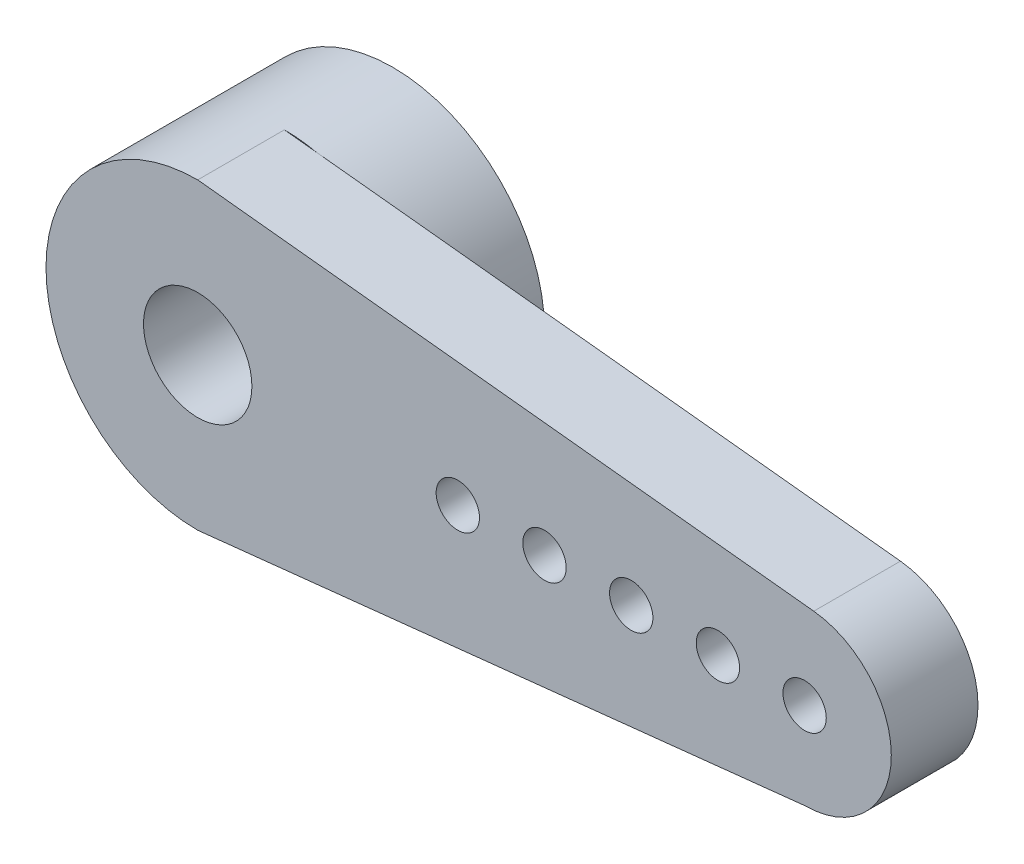
ISO-10303-21;
HEADER;
FILE_DESCRIPTION(('STEP AP214'),'2;1');
FILE_NAME('part.step','',(''),(''),'','','');
FILE_SCHEMA(('AUTOMOTIVE_DESIGN { 1 0 10303 214 1 1 1 1 }'));
ENDSEC;
DATA;
#1=APPLICATION_CONTEXT('core data for automotive mechanical design processes');
#2=APPLICATION_PROTOCOL_DEFINITION('international standard','automotive_design',2000,#1);
#3=PRODUCT_CONTEXT('',#1,'mechanical');
#4=PRODUCT('Part','Part','',(#3));
#5=PRODUCT_RELATED_PRODUCT_CATEGORY('part','',(#4));
#6=PRODUCT_DEFINITION_FORMATION('','',#4);
#7=PRODUCT_DEFINITION_CONTEXT('part definition',#1,'design');
#8=PRODUCT_DEFINITION('design','',#6,#7);
#9=PRODUCT_DEFINITION_SHAPE('','',#8);
#10=(LENGTH_UNIT() NAMED_UNIT(*) SI_UNIT(.MILLI.,.METRE.));
#11=(NAMED_UNIT(*) PLANE_ANGLE_UNIT() SI_UNIT($,.RADIAN.));
#12=(NAMED_UNIT(*) SI_UNIT($,.STERADIAN.) SOLID_ANGLE_UNIT());
#13=UNCERTAINTY_MEASURE_WITH_UNIT(LENGTH_MEASURE(1.E-05),#10,'distance_accuracy_value','');
#14=(GEOMETRIC_REPRESENTATION_CONTEXT(3) GLOBAL_UNCERTAINTY_ASSIGNED_CONTEXT((#13)) GLOBAL_UNIT_ASSIGNED_CONTEXT((#10,
#11,#12)) REPRESENTATION_CONTEXT('',''));
#15=CARTESIAN_POINT('',(0.,0.,0.));
#16=DIRECTION('',(0.,0.,1.));
#17=DIRECTION('',(1.,0.,0.));
#18=AXIS2_PLACEMENT_3D('',#15,#16,#17);
#19=CARTESIAN_POINT('',(0.,0.,0.));
#20=DIRECTION('',(0.,0.,1.));
#21=DIRECTION('',(1.,0.,0.));
#22=AXIS2_PLACEMENT_3D('',#19,#20,#21);
#23=PLANE('',#22);
#24=CARTESIAN_POINT('',(6.,0.,0.));
#25=DIRECTION('',(0.,0.,1.));
#26=DIRECTION('',(1.,0.,0.));
#27=AXIS2_PLACEMENT_3D('',#24,#25,#26);
#28=CIRCLE('',#27,0.500000000000001);
#29=CARTESIAN_POINT('',(6.5,0.,0.));
#30=VERTEX_POINT('',#29);
#31=EDGE_CURVE('E136',#30,#30,#28,.F.);
#32=ORIENTED_EDGE('',*,*,#31,.F.);
#33=EDGE_LOOP('',(#32));
#34=FACE_BOUND('',#33,.T.);
#35=CARTESIAN_POINT('',(8.,0.,0.));
#36=DIRECTION('',(0.,0.,1.));
#37=DIRECTION('',(1.,0.,0.));
#38=AXIS2_PLACEMENT_3D('',#35,#36,#37);
#39=CIRCLE('',#38,0.500000000000001);
#40=CARTESIAN_POINT('',(8.5,0.,0.));
#41=VERTEX_POINT('',#40);
#42=EDGE_CURVE('E142',#41,#41,#39,.F.);
#43=ORIENTED_EDGE('',*,*,#42,.F.);
#44=EDGE_LOOP('',(#43));
#45=FACE_BOUND('',#44,.T.);
#46=CARTESIAN_POINT('',(10.,0.,0.));
#47=DIRECTION('',(0.,0.,1.));
#48=DIRECTION('',(1.,0.,0.));
#49=AXIS2_PLACEMENT_3D('',#46,#47,#48);
#50=CIRCLE('',#49,0.500000000000001);
#51=CARTESIAN_POINT('',(10.5,0.,0.));
#52=VERTEX_POINT('',#51);
#53=EDGE_CURVE('E148',#52,#52,#50,.F.);
#54=ORIENTED_EDGE('',*,*,#53,.F.);
#55=EDGE_LOOP('',(#54));
#56=FACE_BOUND('',#55,.T.);
#57=CARTESIAN_POINT('',(12.,0.,0.));
#58=DIRECTION('',(0.,0.,1.));
#59=DIRECTION('',(1.,0.,0.));
#60=AXIS2_PLACEMENT_3D('',#57,#58,#59);
#61=CIRCLE('',#60,0.500000000000001);
#62=CARTESIAN_POINT('',(12.5,0.,0.));
#63=VERTEX_POINT('',#62);
#64=EDGE_CURVE('E154',#63,#63,#61,.F.);
#65=ORIENTED_EDGE('',*,*,#64,.F.);
#66=EDGE_LOOP('',(#65));
#67=FACE_BOUND('',#66,.T.);
#68=CARTESIAN_POINT('',(14.,0.,0.));
#69=DIRECTION('',(0.,0.,1.));
#70=DIRECTION('',(1.,0.,0.));
#71=AXIS2_PLACEMENT_3D('',#68,#69,#70);
#72=CIRCLE('',#71,0.500000000000001);
#73=CARTESIAN_POINT('',(14.5,0.,0.));
#74=VERTEX_POINT('',#73);
#75=EDGE_CURVE('E161',#74,#74,#72,.T.);
#76=ORIENTED_EDGE('',*,*,#75,.T.);
#77=EDGE_LOOP('',(#76));
#78=FACE_BOUND('',#77,.T.);
#79=CARTESIAN_POINT('',(0.,0.,0.));
#80=DIRECTION('',(0.,0.,-1.));
#81=DIRECTION('',(-1.,0.,0.));
#82=AXIS2_PLACEMENT_3D('',#79,#80,#81);
#83=CIRCLE('',#82,3.5);
#84=CARTESIAN_POINT('',(0.736039193596259,3.42173147770104,0.));
#85=VERTEX_POINT('',#84);
#86=CARTESIAN_POINT('',(0.741488020176546,-3.42055485498108,0.));
#87=VERTEX_POINT('',#86);
#88=EDGE_CURVE('E11',#85,#87,#83,.T.);
#89=ORIENTED_EDGE('',*,*,#88,.F.);
#90=DIRECTION('',(-0.994393675829005,0.105741276100108,0.));
#91=VECTOR('',#90,1.);
#92=CARTESIAN_POINT('',(0.,3.5,0.));
#93=LINE('',#92,#91);
#94=CARTESIAN_POINT('',(14.2114825522002,1.98878735165801,0.));
#95=VERTEX_POINT('',#94);
#96=EDGE_CURVE('E107',#95,#85,#93,.T.);
#97=ORIENTED_EDGE('',*,*,#96,.F.);
#98=CARTESIAN_POINT('',(14.,0.,0.));
#99=DIRECTION('',(0.,0.,1.));
#100=DIRECTION('',(1.,0.,0.));
#101=AXIS2_PLACEMENT_3D('',#98,#99,#100);
#102=CIRCLE('',#101,2.);
#103=CARTESIAN_POINT('',(14.,-2.,0.));
#104=VERTEX_POINT('',#103);
#105=EDGE_CURVE('E74',#104,#95,#102,.T.);
#106=ORIENTED_EDGE('',*,*,#105,.F.);
#107=DIRECTION('',(0.994309153919809,0.106533123634266,0.));
#108=VECTOR('',#107,1.);
#109=CARTESIAN_POINT('',(0.,-3.5,0.));
#110=LINE('',#109,#108);
#111=EDGE_CURVE('E67',#87,#104,#110,.T.);
#112=ORIENTED_EDGE('',*,*,#111,.F.);
#113=EDGE_LOOP('',(#89,#97,#106,#112));
#114=FACE_BOUND('',#113,.T.);
#115=ADVANCED_FACE('F33',(#34,#45,#56,#67,#78,#114),#23,.F.);
#116=CARTESIAN_POINT('',(0.,0.,2.));
#117=DIRECTION('',(0.,0.,1.));
#118=DIRECTION('',(1.,0.,0.));
#119=AXIS2_PLACEMENT_3D('',#116,#117,#118);
#120=PLANE('',#119);
#121=CARTESIAN_POINT('',(6.,0.,2.));
#122=DIRECTION('',(0.,0.,1.));
#123=DIRECTION('',(1.,0.,0.));
#124=AXIS2_PLACEMENT_3D('',#121,#122,#123);
#125=CIRCLE('',#124,0.500000000000001);
#126=CARTESIAN_POINT('',(6.5,0.,2.));
#127=VERTEX_POINT('',#126);
#128=EDGE_CURVE('E133',#127,#127,#125,.T.);
#129=ORIENTED_EDGE('',*,*,#128,.F.);
#130=EDGE_LOOP('',(#129));
#131=FACE_BOUND('',#130,.T.);
#132=CARTESIAN_POINT('',(8.,0.,2.));
#133=DIRECTION('',(0.,0.,1.));
#134=DIRECTION('',(1.,0.,0.));
#135=AXIS2_PLACEMENT_3D('',#132,#133,#134);
#136=CIRCLE('',#135,0.500000000000001);
#137=CARTESIAN_POINT('',(8.5,0.,2.));
#138=VERTEX_POINT('',#137);
#139=EDGE_CURVE('E139',#138,#138,#136,.T.);
#140=ORIENTED_EDGE('',*,*,#139,.F.);
#141=EDGE_LOOP('',(#140));
#142=FACE_BOUND('',#141,.T.);
#143=CARTESIAN_POINT('',(10.,0.,2.));
#144=DIRECTION('',(0.,0.,1.));
#145=DIRECTION('',(1.,0.,0.));
#146=AXIS2_PLACEMENT_3D('',#143,#144,#145);
#147=CIRCLE('',#146,0.500000000000001);
#148=CARTESIAN_POINT('',(10.5,0.,2.));
#149=VERTEX_POINT('',#148);
#150=EDGE_CURVE('E145',#149,#149,#147,.T.);
#151=ORIENTED_EDGE('',*,*,#150,.F.);
#152=EDGE_LOOP('',(#151));
#153=FACE_BOUND('',#152,.T.);
#154=CARTESIAN_POINT('',(12.,0.,2.));
#155=DIRECTION('',(0.,0.,1.));
#156=DIRECTION('',(1.,0.,0.));
#157=AXIS2_PLACEMENT_3D('',#154,#155,#156);
#158=CIRCLE('',#157,0.500000000000001);
#159=CARTESIAN_POINT('',(12.5,0.,2.));
#160=VERTEX_POINT('',#159);
#161=EDGE_CURVE('E151',#160,#160,#158,.T.);
#162=ORIENTED_EDGE('',*,*,#161,.F.);
#163=EDGE_LOOP('',(#162));
#164=FACE_BOUND('',#163,.T.);
#165=CARTESIAN_POINT('',(14.,0.,2.));
#166=DIRECTION('',(0.,0.,1.));
#167=DIRECTION('',(1.,0.,0.));
#168=AXIS2_PLACEMENT_3D('',#165,#166,#167);
#169=CIRCLE('',#168,0.500000000000001);
#170=CARTESIAN_POINT('',(14.5,0.,2.));
#171=VERTEX_POINT('',#170);
#172=EDGE_CURVE('E164',#171,#171,#169,.T.);
#173=ORIENTED_EDGE('',*,*,#172,.F.);
#174=EDGE_LOOP('',(#173));
#175=FACE_BOUND('',#174,.T.);
#176=CARTESIAN_POINT('',(0.,0.,2.));
#177=DIRECTION('',(0.,0.,1.));
#178=DIRECTION('',(1.,0.,0.));
#179=AXIS2_PLACEMENT_3D('',#176,#177,#178);
#180=CIRCLE('',#179,3.5);
#181=CARTESIAN_POINT('',(0.,3.5,2.));
#182=VERTEX_POINT('',#181);
#183=CARTESIAN_POINT('',(0.,-3.5,2.));
#184=VERTEX_POINT('',#183);
#185=EDGE_CURVE('E111',#182,#184,#180,.T.);
#186=ORIENTED_EDGE('',*,*,#185,.T.);
#187=DIRECTION('',(0.994309153919809,0.106533123634266,0.));
#188=VECTOR('',#187,1.);
#189=CARTESIAN_POINT('',(0.,-3.5,2.));
#190=LINE('',#189,#188);
#191=CARTESIAN_POINT('',(14.,-2.,2.));
#192=VERTEX_POINT('',#191);
#193=EDGE_CURVE('E80',#184,#192,#190,.T.);
#194=ORIENTED_EDGE('',*,*,#193,.T.);
#195=CARTESIAN_POINT('',(14.,0.,2.));
#196=DIRECTION('',(0.,0.,1.));
#197=DIRECTION('',(1.,0.,0.));
#198=AXIS2_PLACEMENT_3D('',#195,#196,#197);
#199=CIRCLE('',#198,2.);
#200=CARTESIAN_POINT('',(14.2114825522002,1.98878735165801,2.));
#201=VERTEX_POINT('',#200);
#202=EDGE_CURVE('E115',#192,#201,#199,.T.);
#203=ORIENTED_EDGE('',*,*,#202,.T.);
#204=DIRECTION('',(-0.994393675829005,0.105741276100108,0.));
#205=VECTOR('',#204,1.);
#206=CARTESIAN_POINT('',(0.,3.5,2.));
#207=LINE('',#206,#205);
#208=EDGE_CURVE('E52',#201,#182,#207,.T.);
#209=ORIENTED_EDGE('',*,*,#208,.T.);
#210=EDGE_LOOP('',(#186,#194,#203,#209));
#211=FACE_BOUND('',#210,.T.);
#212=CARTESIAN_POINT('',(0.,0.,2.));
#213=DIRECTION('',(0.,0.,1.));
#214=DIRECTION('',(1.,0.,0.));
#215=AXIS2_PLACEMENT_3D('',#212,#213,#214);
#216=CIRCLE('',#215,1.25);
#217=CARTESIAN_POINT('',(1.25,0.,2.));
#218=VERTEX_POINT('',#217);
#219=EDGE_CURVE('E158',#218,#218,#216,.T.);
#220=ORIENTED_EDGE('',*,*,#219,.F.);
#221=EDGE_LOOP('',(#220));
#222=FACE_BOUND('',#221,.T.);
#223=ADVANCED_FACE('F178',(#131,#142,#153,#164,#175,#211,#222),#120,.T.);
#224=CARTESIAN_POINT('',(0.,0.,0.));
#225=DIRECTION('',(0.,0.,-1.));
#226=DIRECTION('',(-1.,0.,0.));
#227=AXIS2_PLACEMENT_3D('',#224,#225,#226);
#228=CIRCLE('',#227,2.5);
#229=CARTESIAN_POINT('',(-2.5,0.,0.));
#230=VERTEX_POINT('',#229);
#231=EDGE_CURVE('E200',#230,#230,#228,.T.);
#232=ORIENTED_EDGE('',*,*,#231,.T.);
#233=EDGE_LOOP('',(#232));
#234=FACE_BOUND('',#233,.T.);
#235=CARTESIAN_POINT('',(0.,0.,0.));
#236=DIRECTION('',(0.,0.,1.));
#237=DIRECTION('',(1.,0.,0.));
#238=AXIS2_PLACEMENT_3D('',#235,#236,#237);
#239=CIRCLE('',#238,1.25);
#240=CARTESIAN_POINT('',(1.25,0.,0.));
#241=VERTEX_POINT('',#240);
#242=EDGE_CURVE('E157',#241,#241,#239,.T.);
#243=ORIENTED_EDGE('',*,*,#242,.T.);
#244=EDGE_LOOP('',(#243));
#245=FACE_BOUND('',#244,.T.);
#246=ADVANCED_FACE('F181',(#234,#245),#23,.F.);
#247=CARTESIAN_POINT('',(0.,0.,2.));
#248=DIRECTION('',(0.,0.,-1.));
#249=DIRECTION('',(-1.,0.,0.));
#250=AXIS2_PLACEMENT_3D('',#247,#248,#249);
#251=CYLINDRICAL_SURFACE('',#250,3.5);
#252=DIRECTION('',(0.,0.,-1.));
#253=VECTOR('',#252,1.);
#254=CARTESIAN_POINT('',(0.,3.5,2.));
#255=LINE('',#254,#253);
#256=CARTESIAN_POINT('',(0.,3.5,0.));
#257=VERTEX_POINT('',#256);
#258=EDGE_CURVE('E104',#182,#257,#255,.T.);
#259=ORIENTED_EDGE('',*,*,#258,.T.);
#260=EDGE_CURVE('E91',#257,#85,#83,.T.);
#261=ORIENTED_EDGE('',*,*,#260,.T.);
#262=ORIENTED_EDGE('',*,*,#88,.T.);
#263=CARTESIAN_POINT('',(0.,-3.5,0.));
#264=VERTEX_POINT('',#263);
#265=EDGE_CURVE('E99',#87,#264,#83,.T.);
#266=ORIENTED_EDGE('',*,*,#265,.T.);
#267=DIRECTION('',(0.,0.,-1.));
#268=VECTOR('',#267,1.);
#269=CARTESIAN_POINT('',(0.,-3.5,2.));
#270=LINE('',#269,#268);
#271=EDGE_CURVE('E43',#184,#264,#270,.T.);
#272=ORIENTED_EDGE('',*,*,#271,.F.);
#273=ORIENTED_EDGE('',*,*,#185,.F.);
#274=EDGE_LOOP('',(#259,#261,#262,#266,#272,#273));
#275=FACE_BOUND('',#274,.T.);
#276=CARTESIAN_POINT('',(0.,0.,-2.5));
#277=DIRECTION('',(0.,0.,-1.));
#278=DIRECTION('',(-1.,0.,0.));
#279=AXIS2_PLACEMENT_3D('',#276,#277,#278);
#280=CIRCLE('',#279,3.5);
#281=CARTESIAN_POINT('',(-3.5,0.,-2.5));
#282=VERTEX_POINT('',#281);
#283=EDGE_CURVE('E98',#282,#282,#280,.T.);
#284=ORIENTED_EDGE('',*,*,#283,.F.);
#285=EDGE_LOOP('',(#284));
#286=FACE_BOUND('',#285,.T.);
#287=ADVANCED_FACE('F35',(#275,#286),#251,.T.);
#288=CARTESIAN_POINT('',(0.,-3.5,2.));
#289=DIRECTION('',(-0.106533123634266,0.994309153919809,0.));
#290=DIRECTION('',(-0.994309153919809,-0.106533123634266,0.));
#291=AXIS2_PLACEMENT_3D('',#288,#289,#290);
#292=PLANE('',#291);
#293=EDGE_CURVE('E127',#264,#87,#110,.T.);
#294=ORIENTED_EDGE('',*,*,#293,.T.);
#295=ORIENTED_EDGE('',*,*,#111,.T.);
#296=DIRECTION('',(0.,0.,-1.));
#297=VECTOR('',#296,1.);
#298=CARTESIAN_POINT('',(14.,-2.,2.));
#299=LINE('',#298,#297);
#300=EDGE_CURVE('E113',#192,#104,#299,.T.);
#301=ORIENTED_EDGE('',*,*,#300,.F.);
#302=ORIENTED_EDGE('',*,*,#193,.F.);
#303=ORIENTED_EDGE('',*,*,#271,.T.);
#304=EDGE_LOOP('',(#294,#295,#301,#302,#303));
#305=FACE_BOUND('',#304,.T.);
#306=ADVANCED_FACE('F173',(#305),#292,.F.);
#307=CARTESIAN_POINT('',(14.,0.,2.));
#308=DIRECTION('',(0.,0.,-1.));
#309=DIRECTION('',(-1.,0.,0.));
#310=AXIS2_PLACEMENT_3D('',#307,#308,#309);
#311=CYLINDRICAL_SURFACE('',#310,2.);
#312=ORIENTED_EDGE('',*,*,#105,.T.);
#313=DIRECTION('',(0.,0.,-1.));
#314=VECTOR('',#313,1.);
#315=CARTESIAN_POINT('',(14.2114825522002,1.98878735165801,2.));
#316=LINE('',#315,#314);
#317=EDGE_CURVE('E112',#201,#95,#316,.T.);
#318=ORIENTED_EDGE('',*,*,#317,.F.);
#319=ORIENTED_EDGE('',*,*,#202,.F.);
#320=ORIENTED_EDGE('',*,*,#300,.T.);
#321=EDGE_LOOP('',(#312,#318,#319,#320));
#322=FACE_BOUND('',#321,.T.);
#323=ADVANCED_FACE('F310',(#322),#311,.T.);
#324=CARTESIAN_POINT('',(0.,3.5,2.));
#325=DIRECTION('',(-0.105741276100108,-0.994393675829005,0.));
#326=DIRECTION('',(0.994393675829005,-0.105741276100108,0.));
#327=AXIS2_PLACEMENT_3D('',#324,#325,#326);
#328=PLANE('',#327);
#329=ORIENTED_EDGE('',*,*,#96,.T.);
#330=EDGE_CURVE('E94',#85,#257,#93,.T.);
#331=ORIENTED_EDGE('',*,*,#330,.T.);
#332=ORIENTED_EDGE('',*,*,#258,.F.);
#333=ORIENTED_EDGE('',*,*,#208,.F.);
#334=ORIENTED_EDGE('',*,*,#317,.T.);
#335=EDGE_LOOP('',(#329,#331,#332,#333,#334));
#336=FACE_BOUND('',#335,.T.);
#337=ADVANCED_FACE('F103',(#336),#328,.F.);
#338=CARTESIAN_POINT('',(14.,0.,2.));
#339=DIRECTION('',(0.,0.,-1.));
#340=DIRECTION('',(-1.,0.,0.));
#341=AXIS2_PLACEMENT_3D('',#338,#339,#340);
#342=CYLINDRICAL_SURFACE('',#341,0.500000000000001);
#343=ORIENTED_EDGE('',*,*,#172,.T.);
#344=EDGE_LOOP('',(#343));
#345=FACE_BOUND('',#344,.T.);
#346=ORIENTED_EDGE('',*,*,#75,.F.);
#347=EDGE_LOOP('',(#346));
#348=FACE_BOUND('',#347,.T.);
#349=ADVANCED_FACE('F206',(#345,#348),#342,.F.);
#350=CARTESIAN_POINT('',(0.,0.,2.));
#351=DIRECTION('',(0.,0.,-1.));
#352=DIRECTION('',(-1.,0.,0.));
#353=AXIS2_PLACEMENT_3D('',#350,#351,#352);
#354=CYLINDRICAL_SURFACE('',#353,1.25);
#355=ORIENTED_EDGE('',*,*,#219,.T.);
#356=EDGE_LOOP('',(#355));
#357=FACE_BOUND('',#356,.T.);
#358=ORIENTED_EDGE('',*,*,#242,.F.);
#359=EDGE_LOOP('',(#358));
#360=FACE_BOUND('',#359,.T.);
#361=ADVANCED_FACE('F203',(#357,#360),#354,.F.);
#362=CARTESIAN_POINT('',(12.,0.,-0.00100000000000013));
#363=DIRECTION('',(0.,0.,1.));
#364=DIRECTION('',(1.,0.,0.));
#365=AXIS2_PLACEMENT_3D('',#362,#363,#364);
#366=CYLINDRICAL_SURFACE('',#365,0.500000000000001);
#367=ORIENTED_EDGE('',*,*,#161,.T.);
#368=EDGE_LOOP('',(#367));
#369=FACE_BOUND('',#368,.T.);
#370=ORIENTED_EDGE('',*,*,#64,.T.);
#371=EDGE_LOOP('',(#370));
#372=FACE_BOUND('',#371,.T.);
#373=ADVANCED_FACE('F205',(#369,#372),#366,.F.);
#374=CARTESIAN_POINT('',(10.,0.,-0.00100000000000013));
#375=DIRECTION('',(0.,0.,1.));
#376=DIRECTION('',(1.,0.,0.));
#377=AXIS2_PLACEMENT_3D('',#374,#375,#376);
#378=CYLINDRICAL_SURFACE('',#377,0.500000000000001);
#379=ORIENTED_EDGE('',*,*,#150,.T.);
#380=EDGE_LOOP('',(#379));
#381=FACE_BOUND('',#380,.T.);
#382=ORIENTED_EDGE('',*,*,#53,.T.);
#383=EDGE_LOOP('',(#382));
#384=FACE_BOUND('',#383,.T.);
#385=ADVANCED_FACE('F213',(#381,#384),#378,.F.);
#386=CARTESIAN_POINT('',(8.,0.,-0.00100000000000013));
#387=DIRECTION('',(0.,0.,1.));
#388=DIRECTION('',(1.,0.,0.));
#389=AXIS2_PLACEMENT_3D('',#386,#387,#388);
#390=CYLINDRICAL_SURFACE('',#389,0.500000000000001);
#391=ORIENTED_EDGE('',*,*,#139,.T.);
#392=EDGE_LOOP('',(#391));
#393=FACE_BOUND('',#392,.T.);
#394=ORIENTED_EDGE('',*,*,#42,.T.);
#395=EDGE_LOOP('',(#394));
#396=FACE_BOUND('',#395,.T.);
#397=ADVANCED_FACE('F221',(#393,#396),#390,.F.);
#398=CARTESIAN_POINT('',(6.,0.,-0.00100000000000013));
#399=DIRECTION('',(0.,0.,1.));
#400=DIRECTION('',(1.,0.,0.));
#401=AXIS2_PLACEMENT_3D('',#398,#399,#400);
#402=CYLINDRICAL_SURFACE('',#401,0.500000000000001);
#403=ORIENTED_EDGE('',*,*,#128,.T.);
#404=EDGE_LOOP('',(#403));
#405=FACE_BOUND('',#404,.T.);
#406=ORIENTED_EDGE('',*,*,#31,.T.);
#407=EDGE_LOOP('',(#406));
#408=FACE_BOUND('',#407,.T.);
#409=ADVANCED_FACE('F225',(#405,#408),#402,.F.);
#410=CARTESIAN_POINT('',(0.,0.,0.));
#411=DIRECTION('',(0.,0.,-1.));
#412=DIRECTION('',(-1.,0.,0.));
#413=AXIS2_PLACEMENT_3D('',#410,#411,#412);
#414=PLANE('',#413);
#415=ORIENTED_EDGE('',*,*,#330,.F.);
#416=ORIENTED_EDGE('',*,*,#260,.F.);
#417=EDGE_LOOP('',(#415,#416));
#418=FACE_BOUND('',#417,.T.);
#419=ADVANCED_FACE('F93',(#418),#414,.F.);
#420=CARTESIAN_POINT('',(0.,0.,-2.5));
#421=DIRECTION('',(0.,0.,-1.));
#422=DIRECTION('',(-1.,0.,0.));
#423=AXIS2_PLACEMENT_3D('',#420,#421,#422);
#424=PLANE('',#423);
#425=ORIENTED_EDGE('',*,*,#283,.T.);
#426=EDGE_LOOP('',(#425));
#427=FACE_BOUND('',#426,.T.);
#428=CARTESIAN_POINT('',(0.,0.,-2.5));
#429=DIRECTION('',(0.,0.,-1.));
#430=DIRECTION('',(-1.,0.,0.));
#431=AXIS2_PLACEMENT_3D('',#428,#429,#430);
#432=CIRCLE('',#431,2.5);
#433=CARTESIAN_POINT('',(-2.5,0.,-2.5));
#434=VERTEX_POINT('',#433);
#435=EDGE_CURVE('E132',#434,#434,#432,.T.);
#436=ORIENTED_EDGE('',*,*,#435,.F.);
#437=EDGE_LOOP('',(#436));
#438=FACE_BOUND('',#437,.T.);
#439=ADVANCED_FACE('F233',(#427,#438),#424,.T.);
#440=ORIENTED_EDGE('',*,*,#293,.F.);
#441=ORIENTED_EDGE('',*,*,#265,.F.);
#442=EDGE_LOOP('',(#440,#441));
#443=FACE_BOUND('',#442,.T.);
#444=ADVANCED_FACE('F175',(#443),#414,.F.);
#445=CARTESIAN_POINT('',(0.,0.,-2.5));
#446=DIRECTION('',(0.,0.,1.));
#447=DIRECTION('',(1.,0.,0.));
#448=AXIS2_PLACEMENT_3D('',#445,#446,#447);
#449=CYLINDRICAL_SURFACE('',#448,2.5);
#450=ORIENTED_EDGE('',*,*,#435,.T.);
#451=EDGE_LOOP('',(#450));
#452=FACE_BOUND('',#451,.T.);
#453=ORIENTED_EDGE('',*,*,#231,.F.);
#454=EDGE_LOOP('',(#453));
#455=FACE_BOUND('',#454,.T.);
#456=ADVANCED_FACE('F232',(#452,#455),#449,.F.);
#457=CLOSED_SHELL('',(#115,#223,#246,#287,#306,#323,#337,#349,#361,#373,#385,#397,#409,#419,
#439,#444,#456));
#458=MANIFOLD_SOLID_BREP('B2',#457);
#459=ADVANCED_BREP_SHAPE_REPRESENTATION('',(#18,#458),#14);
#460=SHAPE_DEFINITION_REPRESENTATION(#9,#459);
ENDSEC;
END-ISO-10303-21;
